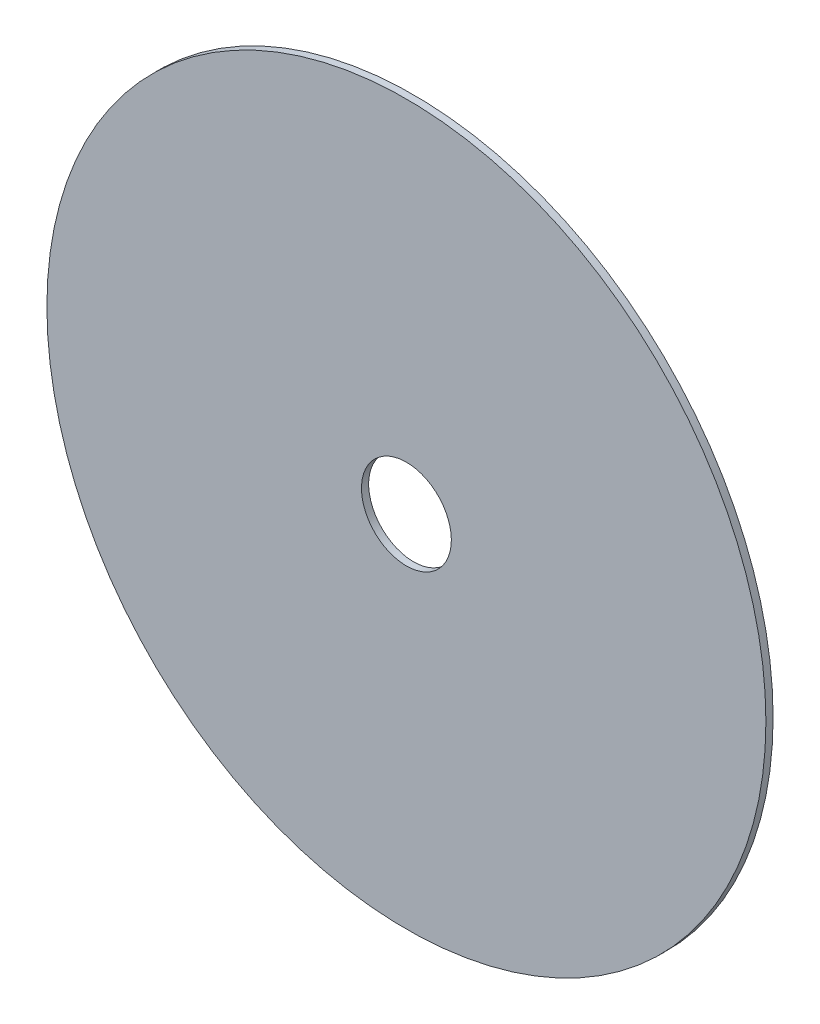
ISO-10303-21;
HEADER;
FILE_DESCRIPTION(('STEP AP214'),'2;1');
FILE_NAME('part.step','',(''),(''),'','','');
FILE_SCHEMA(('AUTOMOTIVE_DESIGN { 1 0 10303 214 1 1 1 1 }'));
ENDSEC;
DATA;
#1=APPLICATION_CONTEXT('core data for automotive mechanical design processes');
#2=APPLICATION_PROTOCOL_DEFINITION('international standard','automotive_design',2000,#1);
#3=PRODUCT_CONTEXT('',#1,'mechanical');
#4=PRODUCT('Part','Part','',(#3));
#5=PRODUCT_RELATED_PRODUCT_CATEGORY('part','',(#4));
#6=PRODUCT_DEFINITION_FORMATION('','',#4);
#7=PRODUCT_DEFINITION_CONTEXT('part definition',#1,'design');
#8=PRODUCT_DEFINITION('design','',#6,#7);
#9=PRODUCT_DEFINITION_SHAPE('','',#8);
#10=(LENGTH_UNIT() NAMED_UNIT(*) SI_UNIT(.MILLI.,.METRE.));
#11=(NAMED_UNIT(*) PLANE_ANGLE_UNIT() SI_UNIT($,.RADIAN.));
#12=(NAMED_UNIT(*) SI_UNIT($,.STERADIAN.) SOLID_ANGLE_UNIT());
#13=UNCERTAINTY_MEASURE_WITH_UNIT(LENGTH_MEASURE(1.E-05),#10,'distance_accuracy_value','');
#14=(GEOMETRIC_REPRESENTATION_CONTEXT(3) GLOBAL_UNCERTAINTY_ASSIGNED_CONTEXT((#13)) GLOBAL_UNIT_ASSIGNED_CONTEXT((#10,
#11,#12)) REPRESENTATION_CONTEXT('',''));
#15=CARTESIAN_POINT('',(0.,0.,0.));
#16=DIRECTION('',(0.,0.,1.));
#17=DIRECTION('',(1.,0.,0.));
#18=AXIS2_PLACEMENT_3D('',#15,#16,#17);
#19=CARTESIAN_POINT('',(0.,0.,1.2));
#20=DIRECTION('',(0.,0.,1.));
#21=DIRECTION('',(1.,0.,0.));
#22=AXIS2_PLACEMENT_3D('',#19,#20,#21);
#23=PLANE('',#22);
#24=CARTESIAN_POINT('',(0.,0.,1.2));
#25=DIRECTION('',(0.,0.,1.));
#26=DIRECTION('',(1.,0.,0.));
#27=AXIS2_PLACEMENT_3D('',#24,#25,#26);
#28=CIRCLE('',#27,60.);
#29=CARTESIAN_POINT('',(60.,0.,1.2));
#30=VERTEX_POINT('',#29);
#31=EDGE_CURVE('E10',#30,#30,#28,.T.);
#32=ORIENTED_EDGE('',*,*,#31,.T.);
#33=EDGE_LOOP('',(#32));
#34=FACE_BOUND('',#33,.T.);
#35=CARTESIAN_POINT('',(0.,0.,1.2));
#36=DIRECTION('',(0.,0.,1.));
#37=DIRECTION('',(1.,0.,0.));
#38=AXIS2_PLACEMENT_3D('',#35,#36,#37);
#39=CIRCLE('',#38,7.5);
#40=CARTESIAN_POINT('',(7.5,0.,1.2));
#41=VERTEX_POINT('',#40);
#42=EDGE_CURVE('E48',#41,#41,#39,.T.);
#43=ORIENTED_EDGE('',*,*,#42,.F.);
#44=EDGE_LOOP('',(#43));
#45=FACE_BOUND('',#44,.T.);
#46=ADVANCED_FACE('F37',(#34,#45),#23,.T.);
#47=CARTESIAN_POINT('',(0.,0.,0.));
#48=DIRECTION('',(0.,0.,1.));
#49=DIRECTION('',(1.,0.,0.));
#50=AXIS2_PLACEMENT_3D('',#47,#48,#49);
#51=PLANE('',#50);
#52=CARTESIAN_POINT('',(0.,0.,0.));
#53=DIRECTION('',(0.,0.,1.));
#54=DIRECTION('',(1.,0.,0.));
#55=AXIS2_PLACEMENT_3D('',#52,#53,#54);
#56=CIRCLE('',#55,60.);
#57=CARTESIAN_POINT('',(60.,0.,0.));
#58=VERTEX_POINT('',#57);
#59=EDGE_CURVE('E41',#58,#58,#56,.T.);
#60=ORIENTED_EDGE('',*,*,#59,.F.);
#61=EDGE_LOOP('',(#60));
#62=FACE_BOUND('',#61,.T.);
#63=CARTESIAN_POINT('',(0.,0.,0.));
#64=DIRECTION('',(0.,0.,1.));
#65=DIRECTION('',(1.,0.,0.));
#66=AXIS2_PLACEMENT_3D('',#63,#64,#65);
#67=CIRCLE('',#66,7.5);
#68=CARTESIAN_POINT('',(7.5,0.,0.));
#69=VERTEX_POINT('',#68);
#70=EDGE_CURVE('E50',#69,#69,#67,.T.);
#71=ORIENTED_EDGE('',*,*,#70,.T.);
#72=EDGE_LOOP('',(#71));
#73=FACE_BOUND('',#72,.T.);
#74=ADVANCED_FACE('F60',(#62,#73),#51,.F.);
#75=CARTESIAN_POINT('',(0.,0.,1.2));
#76=DIRECTION('',(0.,0.,-1.));
#77=DIRECTION('',(-1.,0.,0.));
#78=AXIS2_PLACEMENT_3D('',#75,#76,#77);
#79=CYLINDRICAL_SURFACE('',#78,60.);
#80=ORIENTED_EDGE('',*,*,#31,.F.);
#81=EDGE_LOOP('',(#80));
#82=FACE_BOUND('',#81,.T.);
#83=ORIENTED_EDGE('',*,*,#59,.T.);
#84=EDGE_LOOP('',(#83));
#85=FACE_BOUND('',#84,.T.);
#86=ADVANCED_FACE('F39',(#82,#85),#79,.T.);
#87=CARTESIAN_POINT('',(0.,0.,1.2));
#88=DIRECTION('',(0.,0.,-1.));
#89=DIRECTION('',(-1.,0.,0.));
#90=AXIS2_PLACEMENT_3D('',#87,#88,#89);
#91=CYLINDRICAL_SURFACE('',#90,7.5);
#92=ORIENTED_EDGE('',*,*,#42,.T.);
#93=EDGE_LOOP('',(#92));
#94=FACE_BOUND('',#93,.T.);
#95=ORIENTED_EDGE('',*,*,#70,.F.);
#96=EDGE_LOOP('',(#95));
#97=FACE_BOUND('',#96,.T.);
#98=ADVANCED_FACE('F56',(#94,#97),#91,.F.);
#99=CLOSED_SHELL('',(#46,#74,#86,#98));
#100=MANIFOLD_SOLID_BREP('B2',#99);
#101=ADVANCED_BREP_SHAPE_REPRESENTATION('',(#18,#100),#14);
#102=SHAPE_DEFINITION_REPRESENTATION(#9,#101);
ENDSEC;
END-ISO-10303-21;
